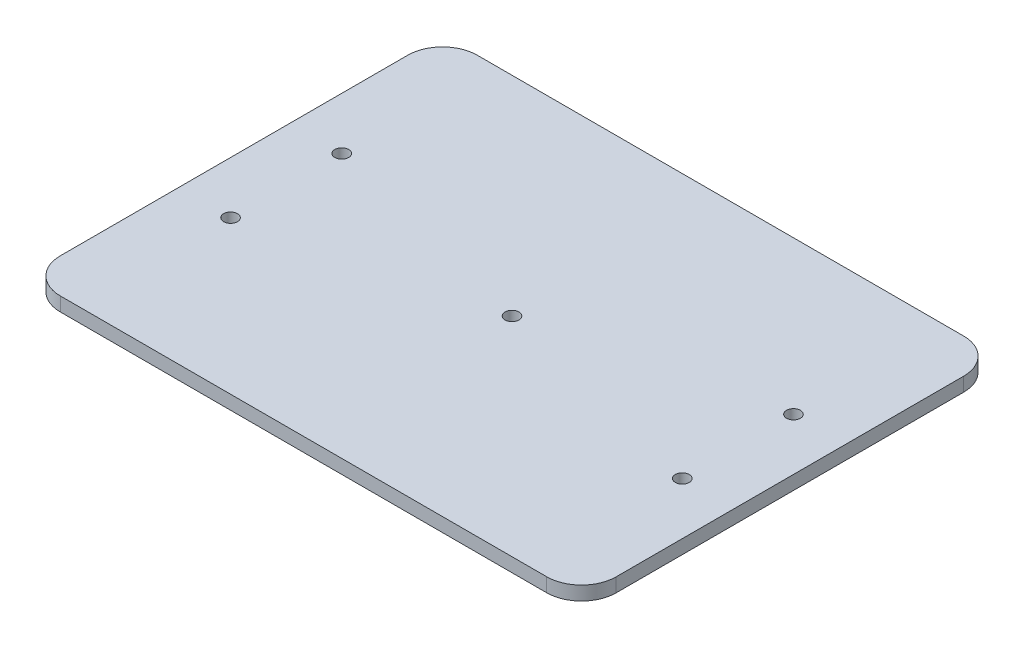
ISO-10303-21;
HEADER;
FILE_DESCRIPTION(('STEP AP214'),'2;1');
FILE_NAME('part.step','',(''),(''),'','','');
FILE_SCHEMA(('AUTOMOTIVE_DESIGN { 1 0 10303 214 1 1 1 1 }'));
ENDSEC;
DATA;
#1=APPLICATION_CONTEXT('core data for automotive mechanical design processes');
#2=APPLICATION_PROTOCOL_DEFINITION('international standard','automotive_design',2000,#1);
#3=PRODUCT_CONTEXT('',#1,'mechanical');
#4=PRODUCT('Part','Part','',(#3));
#5=PRODUCT_RELATED_PRODUCT_CATEGORY('part','',(#4));
#6=PRODUCT_DEFINITION_FORMATION('','',#4);
#7=PRODUCT_DEFINITION_CONTEXT('part definition',#1,'design');
#8=PRODUCT_DEFINITION('design','',#6,#7);
#9=PRODUCT_DEFINITION_SHAPE('','',#8);
#10=(LENGTH_UNIT() NAMED_UNIT(*) SI_UNIT(.MILLI.,.METRE.));
#11=(NAMED_UNIT(*) PLANE_ANGLE_UNIT() SI_UNIT($,.RADIAN.));
#12=(NAMED_UNIT(*) SI_UNIT($,.STERADIAN.) SOLID_ANGLE_UNIT());
#13=UNCERTAINTY_MEASURE_WITH_UNIT(LENGTH_MEASURE(1.E-05),#10,'distance_accuracy_value','');
#14=(GEOMETRIC_REPRESENTATION_CONTEXT(3) GLOBAL_UNCERTAINTY_ASSIGNED_CONTEXT((#13)) GLOBAL_UNIT_ASSIGNED_CONTEXT((#10,
#11,#12)) REPRESENTATION_CONTEXT('',''));
#15=CARTESIAN_POINT('',(0.,0.,0.));
#16=DIRECTION('',(0.,0.,1.));
#17=DIRECTION('',(1.,0.,0.));
#18=AXIS2_PLACEMENT_3D('',#15,#16,#17);
#19=CARTESIAN_POINT('',(-39.5316159250586,2.,-20.983606557377));
#20=DIRECTION('',(1.,0.,0.));
#21=DIRECTION('',(0.,0.,-1.));
#22=AXIS2_PLACEMENT_3D('',#19,#20,#21);
#23=PLANE('',#22);
#24=DIRECTION('',(0.,0.,1.));
#25=VECTOR('',#24,1.);
#26=CARTESIAN_POINT('',(-39.5316159250586,0.,-20.983606557377));
#27=LINE('',#26,#25);
#28=CARTESIAN_POINT('',(-39.5316159250586,0.,-15.983606557377));
#29=VERTEX_POINT('',#28);
#30=CARTESIAN_POINT('',(-39.5316159250586,0.,34.016393442623));
#31=VERTEX_POINT('',#30);
#32=EDGE_CURVE('E186',#29,#31,#27,.T.);
#33=ORIENTED_EDGE('',*,*,#32,.T.);
#34=DIRECTION('',(0.,-1.,0.));
#35=VECTOR('',#34,1.);
#36=CARTESIAN_POINT('',(-39.5316159250586,2.,34.016393442623));
#37=LINE('',#36,#35);
#38=CARTESIAN_POINT('',(-39.5316159250586,2.,34.016393442623));
#39=VERTEX_POINT('',#38);
#40=EDGE_CURVE('E11',#31,#39,#37,.F.);
#41=ORIENTED_EDGE('',*,*,#40,.T.);
#42=DIRECTION('',(0.,0.,1.));
#43=VECTOR('',#42,1.);
#44=CARTESIAN_POINT('',(-39.5316159250586,2.,-20.983606557377));
#45=LINE('',#44,#43);
#46=CARTESIAN_POINT('',(-39.5316159250586,2.,-15.983606557377));
#47=VERTEX_POINT('',#46);
#48=EDGE_CURVE('E139',#47,#39,#45,.T.);
#49=ORIENTED_EDGE('',*,*,#48,.F.);
#50=DIRECTION('',(0.,-1.,0.));
#51=VECTOR('',#50,1.);
#52=CARTESIAN_POINT('',(-39.5316159250586,2.,-15.983606557377));
#53=LINE('',#52,#51);
#54=EDGE_CURVE('E52',#47,#29,#53,.T.);
#55=ORIENTED_EDGE('',*,*,#54,.T.);
#56=EDGE_LOOP('',(#33,#41,#49,#55));
#57=FACE_BOUND('',#56,.T.);
#58=ADVANCED_FACE('F43',(#57),#23,.F.);
#59=CARTESIAN_POINT('',(-39.5316159250586,2.,39.016393442623));
#60=DIRECTION('',(0.,0.,-1.));
#61=DIRECTION('',(-1.,0.,0.));
#62=AXIS2_PLACEMENT_3D('',#59,#60,#61);
#63=PLANE('',#62);
#64=DIRECTION('',(1.,0.,0.));
#65=VECTOR('',#64,1.);
#66=CARTESIAN_POINT('',(-39.5316159250586,0.,39.016393442623));
#67=LINE('',#66,#65);
#68=CARTESIAN_POINT('',(-34.5316159250586,0.,39.016393442623));
#69=VERTEX_POINT('',#68);
#70=CARTESIAN_POINT('',(35.4683840749414,0.,39.016393442623));
#71=VERTEX_POINT('',#70);
#72=EDGE_CURVE('E146',#69,#71,#67,.T.);
#73=ORIENTED_EDGE('',*,*,#72,.T.);
#74=DIRECTION('',(0.,-1.,0.));
#75=VECTOR('',#74,1.);
#76=CARTESIAN_POINT('',(35.4683840749414,2.,39.016393442623));
#77=LINE('',#76,#75);
#78=CARTESIAN_POINT('',(35.4683840749414,2.,39.016393442623));
#79=VERTEX_POINT('',#78);
#80=EDGE_CURVE('E59',#71,#79,#77,.F.);
#81=ORIENTED_EDGE('',*,*,#80,.T.);
#82=DIRECTION('',(1.,0.,0.));
#83=VECTOR('',#82,1.);
#84=CARTESIAN_POINT('',(-39.5316159250586,2.,39.016393442623));
#85=LINE('',#84,#83);
#86=CARTESIAN_POINT('',(-34.5316159250586,2.,39.016393442623));
#87=VERTEX_POINT('',#86);
#88=EDGE_CURVE('E144',#87,#79,#85,.T.);
#89=ORIENTED_EDGE('',*,*,#88,.F.);
#90=DIRECTION('',(0.,-1.,0.));
#91=VECTOR('',#90,1.);
#92=CARTESIAN_POINT('',(-34.5316159250586,2.,39.016393442623));
#93=LINE('',#92,#91);
#94=EDGE_CURVE('E175',#87,#69,#93,.T.);
#95=ORIENTED_EDGE('',*,*,#94,.T.);
#96=EDGE_LOOP('',(#73,#81,#89,#95));
#97=FACE_BOUND('',#96,.T.);
#98=ADVANCED_FACE('F261',(#97),#63,.F.);
#99=CARTESIAN_POINT('',(40.4683840749414,2.,-20.983606557377));
#100=DIRECTION('',(-1.,0.,0.));
#101=DIRECTION('',(0.,0.,1.));
#102=AXIS2_PLACEMENT_3D('',#99,#100,#101);
#103=PLANE('',#102);
#104=DIRECTION('',(0.,0.,-1.));
#105=VECTOR('',#104,1.);
#106=CARTESIAN_POINT('',(40.4683840749414,0.,-20.983606557377));
#107=LINE('',#106,#105);
#108=CARTESIAN_POINT('',(40.4683840749414,0.,34.016393442623));
#109=VERTEX_POINT('',#108);
#110=CARTESIAN_POINT('',(40.4683840749414,0.,-15.983606557377));
#111=VERTEX_POINT('',#110);
#112=EDGE_CURVE('E140',#109,#111,#107,.T.);
#113=ORIENTED_EDGE('',*,*,#112,.T.);
#114=DIRECTION('',(0.,-1.,0.));
#115=VECTOR('',#114,1.);
#116=CARTESIAN_POINT('',(40.4683840749414,2.,-15.983606557377));
#117=LINE('',#116,#115);
#118=CARTESIAN_POINT('',(40.4683840749414,2.,-15.983606557377));
#119=VERTEX_POINT('',#118);
#120=EDGE_CURVE('E115',#111,#119,#117,.F.);
#121=ORIENTED_EDGE('',*,*,#120,.T.);
#122=DIRECTION('',(0.,0.,-1.));
#123=VECTOR('',#122,1.);
#124=CARTESIAN_POINT('',(40.4683840749414,2.,-20.983606557377));
#125=LINE('',#124,#123);
#126=CARTESIAN_POINT('',(40.4683840749414,2.,34.016393442623));
#127=VERTEX_POINT('',#126);
#128=EDGE_CURVE('E202',#127,#119,#125,.T.);
#129=ORIENTED_EDGE('',*,*,#128,.F.);
#130=DIRECTION('',(0.,-1.,0.));
#131=VECTOR('',#130,1.);
#132=CARTESIAN_POINT('',(40.4683840749414,2.,34.016393442623));
#133=LINE('',#132,#131);
#134=EDGE_CURVE('E121',#127,#109,#133,.T.);
#135=ORIENTED_EDGE('',*,*,#134,.T.);
#136=EDGE_LOOP('',(#113,#121,#129,#135));
#137=FACE_BOUND('',#136,.T.);
#138=ADVANCED_FACE('F258',(#137),#103,.F.);
#139=CARTESIAN_POINT('',(-39.5316159250586,2.,-20.983606557377));
#140=DIRECTION('',(0.,0.,1.));
#141=DIRECTION('',(1.,0.,0.));
#142=AXIS2_PLACEMENT_3D('',#139,#140,#141);
#143=PLANE('',#142);
#144=DIRECTION('',(-1.,0.,0.));
#145=VECTOR('',#144,1.);
#146=CARTESIAN_POINT('',(-39.5316159250586,2.,-20.983606557377));
#147=LINE('',#146,#145);
#148=CARTESIAN_POINT('',(35.4683840749414,2.,-20.983606557377));
#149=VERTEX_POINT('',#148);
#150=CARTESIAN_POINT('',(-34.5316159250586,2.,-20.983606557377));
#151=VERTEX_POINT('',#150);
#152=EDGE_CURVE('E131',#149,#151,#147,.T.);
#153=ORIENTED_EDGE('',*,*,#152,.F.);
#154=DIRECTION('',(0.,-1.,0.));
#155=VECTOR('',#154,1.);
#156=CARTESIAN_POINT('',(35.4683840749414,2.,-20.983606557377));
#157=LINE('',#156,#155);
#158=CARTESIAN_POINT('',(35.4683840749414,0.,-20.983606557377));
#159=VERTEX_POINT('',#158);
#160=EDGE_CURVE('E114',#149,#159,#157,.T.);
#161=ORIENTED_EDGE('',*,*,#160,.T.);
#162=DIRECTION('',(-1.,0.,0.));
#163=VECTOR('',#162,1.);
#164=CARTESIAN_POINT('',(-39.5316159250586,0.,-20.983606557377));
#165=LINE('',#164,#163);
#166=CARTESIAN_POINT('',(-34.5316159250586,0.,-20.983606557377));
#167=VERTEX_POINT('',#166);
#168=EDGE_CURVE('E128',#159,#167,#165,.T.);
#169=ORIENTED_EDGE('',*,*,#168,.T.);
#170=DIRECTION('',(0.,-1.,0.));
#171=VECTOR('',#170,1.);
#172=CARTESIAN_POINT('',(-34.5316159250586,2.,-20.983606557377));
#173=LINE('',#172,#171);
#174=EDGE_CURVE('E134',#167,#151,#173,.F.);
#175=ORIENTED_EDGE('',*,*,#174,.T.);
#176=EDGE_LOOP('',(#153,#161,#169,#175));
#177=FACE_BOUND('',#176,.T.);
#178=ADVANCED_FACE('F127',(#177),#143,.F.);
#179=CARTESIAN_POINT('',(0.,2.,0.));
#180=DIRECTION('',(0.,1.,0.));
#181=DIRECTION('',(0.,0.,1.));
#182=AXIS2_PLACEMENT_3D('',#179,#180,#181);
#183=PLANE('',#182);
#184=CARTESIAN_POINT('',(-32.0316159250586,2.,17.016393442623));
#185=DIRECTION('',(0.,1.,0.));
#186=DIRECTION('',(0.,0.,1.));
#187=AXIS2_PLACEMENT_3D('',#184,#185,#186);
#188=CIRCLE('',#187,1.);
#189=CARTESIAN_POINT('',(-32.0316159250586,2.,18.016393442623));
#190=VERTEX_POINT('',#189);
#191=EDGE_CURVE('E210',#190,#190,#188,.T.);
#192=ORIENTED_EDGE('',*,*,#191,.F.);
#193=EDGE_LOOP('',(#192));
#194=FACE_BOUND('',#193,.T.);
#195=CARTESIAN_POINT('',(32.9683840749414,2.,1.01639344262296));
#196=DIRECTION('',(0.,1.,0.));
#197=DIRECTION('',(0.,0.,1.));
#198=AXIS2_PLACEMENT_3D('',#195,#196,#197);
#199=CIRCLE('',#198,0.999999999999998);
#200=CARTESIAN_POINT('',(32.9683840749414,2.,2.01639344262295));
#201=VERTEX_POINT('',#200);
#202=EDGE_CURVE('E216',#201,#201,#199,.T.);
#203=ORIENTED_EDGE('',*,*,#202,.F.);
#204=EDGE_LOOP('',(#203));
#205=FACE_BOUND('',#204,.T.);
#206=CARTESIAN_POINT('',(32.9683840749414,2.,17.016393442623));
#207=DIRECTION('',(0.,1.,0.));
#208=DIRECTION('',(0.,0.,1.));
#209=AXIS2_PLACEMENT_3D('',#206,#207,#208);
#210=CIRCLE('',#209,0.999999999999998);
#211=CARTESIAN_POINT('',(32.9683840749414,2.,18.016393442623));
#212=VERTEX_POINT('',#211);
#213=EDGE_CURVE('E217',#212,#212,#210,.T.);
#214=ORIENTED_EDGE('',*,*,#213,.F.);
#215=EDGE_LOOP('',(#214));
#216=FACE_BOUND('',#215,.T.);
#217=CARTESIAN_POINT('',(0.46838407494143,2.,9.01639344262296));
#218=DIRECTION('',(0.,1.,0.));
#219=DIRECTION('',(0.,0.,1.));
#220=AXIS2_PLACEMENT_3D('',#217,#218,#219);
#221=CIRCLE('',#220,1.);
#222=CARTESIAN_POINT('',(0.46838407494143,2.,10.016393442623));
#223=VERTEX_POINT('',#222);
#224=EDGE_CURVE('E232',#223,#223,#221,.T.);
#225=ORIENTED_EDGE('',*,*,#224,.F.);
#226=EDGE_LOOP('',(#225));
#227=FACE_BOUND('',#226,.T.);
#228=CARTESIAN_POINT('',(-32.0316159250586,2.,1.01639344262296));
#229=DIRECTION('',(0.,1.,0.));
#230=DIRECTION('',(0.,0.,1.));
#231=AXIS2_PLACEMENT_3D('',#228,#229,#230);
#232=CIRCLE('',#231,1.);
#233=CARTESIAN_POINT('',(-32.0316159250586,2.,2.01639344262296));
#234=VERTEX_POINT('',#233);
#235=EDGE_CURVE('E197',#234,#234,#232,.T.);
#236=ORIENTED_EDGE('',*,*,#235,.F.);
#237=EDGE_LOOP('',(#236));
#238=FACE_BOUND('',#237,.T.);
#239=ORIENTED_EDGE('',*,*,#128,.T.);
#240=CARTESIAN_POINT('',(35.4683840749414,2.,-15.983606557377));
#241=DIRECTION('',(0.,1.,0.));
#242=DIRECTION('',(0.,0.,1.));
#243=AXIS2_PLACEMENT_3D('',#240,#241,#242);
#244=CIRCLE('',#243,5.);
#245=EDGE_CURVE('E172',#119,#149,#244,.T.);
#246=ORIENTED_EDGE('',*,*,#245,.T.);
#247=ORIENTED_EDGE('',*,*,#152,.T.);
#248=CARTESIAN_POINT('',(-34.5316159250586,2.,-15.983606557377));
#249=DIRECTION('',(0.,1.,0.));
#250=DIRECTION('',(0.,0.,1.));
#251=AXIS2_PLACEMENT_3D('',#248,#249,#250);
#252=CIRCLE('',#251,5.);
#253=EDGE_CURVE('E164',#151,#47,#252,.T.);
#254=ORIENTED_EDGE('',*,*,#253,.T.);
#255=ORIENTED_EDGE('',*,*,#48,.T.);
#256=CARTESIAN_POINT('',(-34.5316159250586,2.,34.016393442623));
#257=DIRECTION('',(0.,1.,0.));
#258=DIRECTION('',(0.,0.,1.));
#259=AXIS2_PLACEMENT_3D('',#256,#257,#258);
#260=CIRCLE('',#259,5.);
#261=EDGE_CURVE('E66',#39,#87,#260,.T.);
#262=ORIENTED_EDGE('',*,*,#261,.T.);
#263=ORIENTED_EDGE('',*,*,#88,.T.);
#264=CARTESIAN_POINT('',(35.4683840749414,2.,34.016393442623));
#265=DIRECTION('',(0.,1.,0.));
#266=DIRECTION('',(0.,0.,1.));
#267=AXIS2_PLACEMENT_3D('',#264,#265,#266);
#268=CIRCLE('',#267,5.);
#269=EDGE_CURVE('E169',#79,#127,#268,.T.);
#270=ORIENTED_EDGE('',*,*,#269,.T.);
#271=EDGE_LOOP('',(#239,#246,#247,#254,#255,#262,#263,#270));
#272=FACE_BOUND('',#271,.T.);
#273=ADVANCED_FACE('F246',(#194,#205,#216,#227,#238,#272),#183,.T.);
#274=CARTESIAN_POINT('',(0.,0.,0.));
#275=DIRECTION('',(0.,1.,0.));
#276=DIRECTION('',(0.,0.,1.));
#277=AXIS2_PLACEMENT_3D('',#274,#275,#276);
#278=PLANE('',#277);
#279=CARTESIAN_POINT('',(-32.0316159250586,0.,17.016393442623));
#280=DIRECTION('',(0.,1.,0.));
#281=DIRECTION('',(0.,0.,1.));
#282=AXIS2_PLACEMENT_3D('',#279,#280,#281);
#283=CIRCLE('',#282,1.);
#284=CARTESIAN_POINT('',(-32.0316159250586,0.,18.016393442623));
#285=VERTEX_POINT('',#284);
#286=EDGE_CURVE('E221',#285,#285,#283,.T.);
#287=ORIENTED_EDGE('',*,*,#286,.T.);
#288=EDGE_LOOP('',(#287));
#289=FACE_BOUND('',#288,.T.);
#290=CARTESIAN_POINT('',(32.9683840749414,0.,1.01639344262296));
#291=DIRECTION('',(0.,1.,0.));
#292=DIRECTION('',(0.,0.,1.));
#293=AXIS2_PLACEMENT_3D('',#290,#291,#292);
#294=CIRCLE('',#293,0.999999999999998);
#295=CARTESIAN_POINT('',(32.9683840749414,0.,2.01639344262295));
#296=VERTEX_POINT('',#295);
#297=EDGE_CURVE('E212',#296,#296,#294,.T.);
#298=ORIENTED_EDGE('',*,*,#297,.T.);
#299=EDGE_LOOP('',(#298));
#300=FACE_BOUND('',#299,.T.);
#301=CARTESIAN_POINT('',(32.9683840749414,0.,17.016393442623));
#302=DIRECTION('',(0.,1.,0.));
#303=DIRECTION('',(0.,0.,1.));
#304=AXIS2_PLACEMENT_3D('',#301,#302,#303);
#305=CIRCLE('',#304,0.999999999999998);
#306=CARTESIAN_POINT('',(32.9683840749414,0.,18.016393442623));
#307=VERTEX_POINT('',#306);
#308=EDGE_CURVE('E236',#307,#307,#305,.T.);
#309=ORIENTED_EDGE('',*,*,#308,.T.);
#310=EDGE_LOOP('',(#309));
#311=FACE_BOUND('',#310,.T.);
#312=CARTESIAN_POINT('',(0.46838407494143,0.,9.01639344262296));
#313=DIRECTION('',(0.,1.,0.));
#314=DIRECTION('',(0.,0.,1.));
#315=AXIS2_PLACEMENT_3D('',#312,#313,#314);
#316=CIRCLE('',#315,1.);
#317=CARTESIAN_POINT('',(0.46838407494143,0.,10.016393442623));
#318=VERTEX_POINT('',#317);
#319=EDGE_CURVE('E228',#318,#318,#316,.T.);
#320=ORIENTED_EDGE('',*,*,#319,.T.);
#321=EDGE_LOOP('',(#320));
#322=FACE_BOUND('',#321,.T.);
#323=CARTESIAN_POINT('',(-32.0316159250586,0.,1.01639344262296));
#324=DIRECTION('',(0.,1.,0.));
#325=DIRECTION('',(0.,0.,1.));
#326=AXIS2_PLACEMENT_3D('',#323,#324,#325);
#327=CIRCLE('',#326,1.);
#328=CARTESIAN_POINT('',(-32.0316159250586,0.,2.01639344262296));
#329=VERTEX_POINT('',#328);
#330=EDGE_CURVE('E192',#329,#329,#327,.T.);
#331=ORIENTED_EDGE('',*,*,#330,.T.);
#332=EDGE_LOOP('',(#331));
#333=FACE_BOUND('',#332,.T.);
#334=ORIENTED_EDGE('',*,*,#168,.F.);
#335=CARTESIAN_POINT('',(35.4683840749414,0.,-15.983606557377));
#336=DIRECTION('',(0.,1.,0.));
#337=DIRECTION('',(0.,0.,1.));
#338=AXIS2_PLACEMENT_3D('',#335,#336,#337);
#339=CIRCLE('',#338,5.);
#340=EDGE_CURVE('E110',#159,#111,#339,.F.);
#341=ORIENTED_EDGE('',*,*,#340,.T.);
#342=ORIENTED_EDGE('',*,*,#112,.F.);
#343=CARTESIAN_POINT('',(35.4683840749414,0.,34.016393442623));
#344=DIRECTION('',(0.,1.,0.));
#345=DIRECTION('',(0.,0.,1.));
#346=AXIS2_PLACEMENT_3D('',#343,#344,#345);
#347=CIRCLE('',#346,5.);
#348=EDGE_CURVE('E122',#109,#71,#347,.F.);
#349=ORIENTED_EDGE('',*,*,#348,.T.);
#350=ORIENTED_EDGE('',*,*,#72,.F.);
#351=CARTESIAN_POINT('',(-34.5316159250586,0.,34.016393442623));
#352=DIRECTION('',(0.,1.,0.));
#353=DIRECTION('',(0.,0.,1.));
#354=AXIS2_PLACEMENT_3D('',#351,#352,#353);
#355=CIRCLE('',#354,5.);
#356=EDGE_CURVE('E154',#69,#31,#355,.F.);
#357=ORIENTED_EDGE('',*,*,#356,.T.);
#358=ORIENTED_EDGE('',*,*,#32,.F.);
#359=CARTESIAN_POINT('',(-34.5316159250586,0.,-15.983606557377));
#360=DIRECTION('',(0.,1.,0.));
#361=DIRECTION('',(0.,0.,1.));
#362=AXIS2_PLACEMENT_3D('',#359,#360,#361);
#363=CIRCLE('',#362,5.);
#364=EDGE_CURVE('E133',#29,#167,#363,.F.);
#365=ORIENTED_EDGE('',*,*,#364,.T.);
#366=EDGE_LOOP('',(#334,#341,#342,#349,#350,#357,#358,#365));
#367=FACE_BOUND('',#366,.T.);
#368=ADVANCED_FACE('F136',(#289,#300,#311,#322,#333,#367),#278,.F.);
#369=CARTESIAN_POINT('',(-32.0316159250586,0.,1.01639344262296));
#370=DIRECTION('',(0.,1.,0.));
#371=DIRECTION('',(0.,0.,1.));
#372=AXIS2_PLACEMENT_3D('',#369,#370,#371);
#373=CYLINDRICAL_SURFACE('',#372,1.);
#374=ORIENTED_EDGE('',*,*,#330,.F.);
#375=EDGE_LOOP('',(#374));
#376=FACE_BOUND('',#375,.T.);
#377=ORIENTED_EDGE('',*,*,#235,.T.);
#378=EDGE_LOOP('',(#377));
#379=FACE_BOUND('',#378,.T.);
#380=ADVANCED_FACE('F344',(#376,#379),#373,.F.);
#381=CARTESIAN_POINT('',(0.46838407494143,0.,9.01639344262296));
#382=DIRECTION('',(0.,1.,0.));
#383=DIRECTION('',(0.,0.,1.));
#384=AXIS2_PLACEMENT_3D('',#381,#382,#383);
#385=CYLINDRICAL_SURFACE('',#384,1.);
#386=ORIENTED_EDGE('',*,*,#319,.F.);
#387=EDGE_LOOP('',(#386));
#388=FACE_BOUND('',#387,.T.);
#389=ORIENTED_EDGE('',*,*,#224,.T.);
#390=EDGE_LOOP('',(#389));
#391=FACE_BOUND('',#390,.T.);
#392=ADVANCED_FACE('F334',(#388,#391),#385,.F.);
#393=CARTESIAN_POINT('',(32.9683840749414,0.,17.016393442623));
#394=DIRECTION('',(0.,1.,0.));
#395=DIRECTION('',(0.,0.,1.));
#396=AXIS2_PLACEMENT_3D('',#393,#394,#395);
#397=CYLINDRICAL_SURFACE('',#396,0.999999999999998);
#398=ORIENTED_EDGE('',*,*,#308,.F.);
#399=EDGE_LOOP('',(#398));
#400=FACE_BOUND('',#399,.T.);
#401=ORIENTED_EDGE('',*,*,#213,.T.);
#402=EDGE_LOOP('',(#401));
#403=FACE_BOUND('',#402,.T.);
#404=ADVANCED_FACE('F244',(#400,#403),#397,.F.);
#405=CARTESIAN_POINT('',(32.9683840749414,0.,1.01639344262296));
#406=DIRECTION('',(0.,1.,0.));
#407=DIRECTION('',(0.,0.,1.));
#408=AXIS2_PLACEMENT_3D('',#405,#406,#407);
#409=CYLINDRICAL_SURFACE('',#408,0.999999999999998);
#410=ORIENTED_EDGE('',*,*,#297,.F.);
#411=EDGE_LOOP('',(#410));
#412=FACE_BOUND('',#411,.T.);
#413=ORIENTED_EDGE('',*,*,#202,.T.);
#414=EDGE_LOOP('',(#413));
#415=FACE_BOUND('',#414,.T.);
#416=ADVANCED_FACE('F315',(#412,#415),#409,.F.);
#417=CARTESIAN_POINT('',(-32.0316159250586,0.,17.016393442623));
#418=DIRECTION('',(0.,1.,0.));
#419=DIRECTION('',(0.,0.,1.));
#420=AXIS2_PLACEMENT_3D('',#417,#418,#419);
#421=CYLINDRICAL_SURFACE('',#420,1.);
#422=ORIENTED_EDGE('',*,*,#286,.F.);
#423=EDGE_LOOP('',(#422));
#424=FACE_BOUND('',#423,.T.);
#425=ORIENTED_EDGE('',*,*,#191,.T.);
#426=EDGE_LOOP('',(#425));
#427=FACE_BOUND('',#426,.T.);
#428=ADVANCED_FACE('F279',(#424,#427),#421,.F.);
#429=CARTESIAN_POINT('',(35.4683840749414,2.,-15.983606557377));
#430=DIRECTION('',(0.,-1.,0.));
#431=DIRECTION('',(0.,0.,-1.));
#432=AXIS2_PLACEMENT_3D('',#429,#430,#431);
#433=CYLINDRICAL_SURFACE('',#432,5.);
#434=ORIENTED_EDGE('',*,*,#245,.F.);
#435=ORIENTED_EDGE('',*,*,#120,.F.);
#436=ORIENTED_EDGE('',*,*,#340,.F.);
#437=ORIENTED_EDGE('',*,*,#160,.F.);
#438=EDGE_LOOP('',(#434,#435,#436,#437));
#439=FACE_BOUND('',#438,.T.);
#440=ADVANCED_FACE('F113',(#439),#433,.T.);
#441=CARTESIAN_POINT('',(35.4683840749414,2.,34.016393442623));
#442=DIRECTION('',(0.,-1.,0.));
#443=DIRECTION('',(0.,0.,-1.));
#444=AXIS2_PLACEMENT_3D('',#441,#442,#443);
#445=CYLINDRICAL_SURFACE('',#444,5.);
#446=ORIENTED_EDGE('',*,*,#269,.F.);
#447=ORIENTED_EDGE('',*,*,#80,.F.);
#448=ORIENTED_EDGE('',*,*,#348,.F.);
#449=ORIENTED_EDGE('',*,*,#134,.F.);
#450=EDGE_LOOP('',(#446,#447,#448,#449));
#451=FACE_BOUND('',#450,.T.);
#452=ADVANCED_FACE('F260',(#451),#445,.T.);
#453=CARTESIAN_POINT('',(-34.5316159250586,2.,34.016393442623));
#454=DIRECTION('',(0.,-1.,0.));
#455=DIRECTION('',(0.,0.,-1.));
#456=AXIS2_PLACEMENT_3D('',#453,#454,#455);
#457=CYLINDRICAL_SURFACE('',#456,5.);
#458=ORIENTED_EDGE('',*,*,#261,.F.);
#459=ORIENTED_EDGE('',*,*,#40,.F.);
#460=ORIENTED_EDGE('',*,*,#356,.F.);
#461=ORIENTED_EDGE('',*,*,#94,.F.);
#462=EDGE_LOOP('',(#458,#459,#460,#461));
#463=FACE_BOUND('',#462,.T.);
#464=ADVANCED_FACE('F264',(#463),#457,.T.);
#465=CARTESIAN_POINT('',(-34.5316159250586,2.,-15.983606557377));
#466=DIRECTION('',(0.,-1.,0.));
#467=DIRECTION('',(0.,0.,-1.));
#468=AXIS2_PLACEMENT_3D('',#465,#466,#467);
#469=CYLINDRICAL_SURFACE('',#468,5.);
#470=ORIENTED_EDGE('',*,*,#253,.F.);
#471=ORIENTED_EDGE('',*,*,#174,.F.);
#472=ORIENTED_EDGE('',*,*,#364,.F.);
#473=ORIENTED_EDGE('',*,*,#54,.F.);
#474=EDGE_LOOP('',(#470,#471,#472,#473));
#475=FACE_BOUND('',#474,.T.);
#476=ADVANCED_FACE('F45',(#475),#469,.T.);
#477=CLOSED_SHELL('',(#58,#98,#138,#178,#273,#368,#380,#392,#404,#416,#428,#440,#452,#464,#476));
#478=MANIFOLD_SOLID_BREP('B2',#477);
#479=ADVANCED_BREP_SHAPE_REPRESENTATION('',(#18,#478),#14);
#480=SHAPE_DEFINITION_REPRESENTATION(#9,#479);
ENDSEC;
END-ISO-10303-21;
